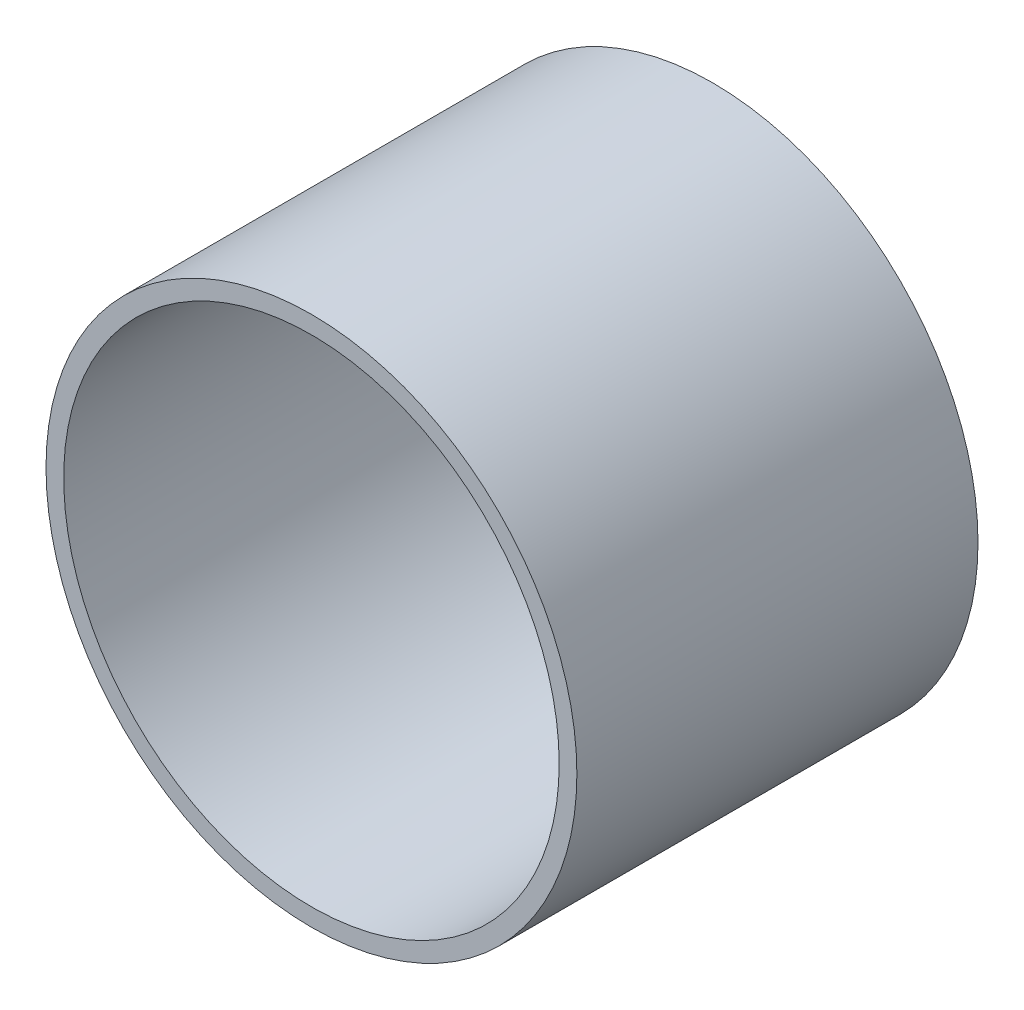
ISO-10303-21;
HEADER;
FILE_DESCRIPTION(('STEP AP214'),'2;1');
FILE_NAME('part.step','',(''),(''),'','','');
FILE_SCHEMA(('AUTOMOTIVE_DESIGN { 1 0 10303 214 1 1 1 1 }'));
ENDSEC;
DATA;
#1=APPLICATION_CONTEXT('core data for automotive mechanical design processes');
#2=APPLICATION_PROTOCOL_DEFINITION('international standard','automotive_design',2000,#1);
#3=PRODUCT_CONTEXT('',#1,'mechanical');
#4=PRODUCT('Part','Part','',(#3));
#5=PRODUCT_RELATED_PRODUCT_CATEGORY('part','',(#4));
#6=PRODUCT_DEFINITION_FORMATION('','',#4);
#7=PRODUCT_DEFINITION_CONTEXT('part definition',#1,'design');
#8=PRODUCT_DEFINITION('design','',#6,#7);
#9=PRODUCT_DEFINITION_SHAPE('','',#8);
#10=(LENGTH_UNIT() NAMED_UNIT(*) SI_UNIT(.MILLI.,.METRE.));
#11=(NAMED_UNIT(*) PLANE_ANGLE_UNIT() SI_UNIT($,.RADIAN.));
#12=(NAMED_UNIT(*) SI_UNIT($,.STERADIAN.) SOLID_ANGLE_UNIT());
#13=UNCERTAINTY_MEASURE_WITH_UNIT(LENGTH_MEASURE(1.E-05),#10,'distance_accuracy_value','');
#14=(GEOMETRIC_REPRESENTATION_CONTEXT(3) GLOBAL_UNCERTAINTY_ASSIGNED_CONTEXT((#13)) GLOBAL_UNIT_ASSIGNED_CONTEXT((#10,
#11,#12)) REPRESENTATION_CONTEXT('',''));
#15=CARTESIAN_POINT('',(0.,0.,0.));
#16=DIRECTION('',(0.,0.,1.));
#17=DIRECTION('',(1.,0.,0.));
#18=AXIS2_PLACEMENT_3D('',#15,#16,#17);
#19=CARTESIAN_POINT('',(0.,0.,-132.));
#20=DIRECTION('',(0.,0.,1.));
#21=DIRECTION('',(1.,0.,0.));
#22=AXIS2_PLACEMENT_3D('',#19,#20,#21);
#23=CYLINDRICAL_SURFACE('',#22,42.);
#24=CARTESIAN_POINT('',(0.,0.,-205.));
#25=DIRECTION('',(0.,0.,1.));
#26=DIRECTION('',(1.,0.,0.));
#27=AXIS2_PLACEMENT_3D('',#24,#25,#26);
#28=CIRCLE('',#27,42.);
#29=CARTESIAN_POINT('',(42.,0.,-205.));
#30=VERTEX_POINT('',#29);
#31=EDGE_CURVE('E10',#30,#30,#28,.T.);
#32=ORIENTED_EDGE('',*,*,#31,.F.);
#33=EDGE_LOOP('',(#32));
#34=FACE_BOUND('',#33,.T.);
#35=CARTESIAN_POINT('',(0.,0.,-137.));
#36=DIRECTION('',(0.,0.,1.));
#37=DIRECTION('',(1.,0.,0.));
#38=AXIS2_PLACEMENT_3D('',#35,#36,#37);
#39=CIRCLE('',#38,42.);
#40=CARTESIAN_POINT('',(42.,0.,-137.));
#41=VERTEX_POINT('',#40);
#42=EDGE_CURVE('E51',#41,#41,#39,.T.);
#43=ORIENTED_EDGE('',*,*,#42,.T.);
#44=EDGE_LOOP('',(#43));
#45=FACE_BOUND('',#44,.T.);
#46=ADVANCED_FACE('F37',(#34,#45),#23,.F.);
#47=CARTESIAN_POINT('',(0.,42.,-205.));
#48=DIRECTION('',(0.,0.,1.));
#49=DIRECTION('',(1.,0.,0.));
#50=AXIS2_PLACEMENT_3D('',#47,#48,#49);
#51=PLANE('',#50);
#52=CARTESIAN_POINT('',(0.,0.,-205.));
#53=DIRECTION('',(0.,0.,1.));
#54=DIRECTION('',(1.,0.,0.));
#55=AXIS2_PLACEMENT_3D('',#52,#53,#54);
#56=CIRCLE('',#55,45.);
#57=CARTESIAN_POINT('',(45.,0.,-205.));
#58=VERTEX_POINT('',#57);
#59=EDGE_CURVE('E43',#58,#58,#56,.T.);
#60=ORIENTED_EDGE('',*,*,#59,.F.);
#61=EDGE_LOOP('',(#60));
#62=FACE_BOUND('',#61,.T.);
#63=ORIENTED_EDGE('',*,*,#31,.T.);
#64=EDGE_LOOP('',(#63));
#65=FACE_BOUND('',#64,.T.);
#66=ADVANCED_FACE('F66',(#62,#65),#51,.F.);
#67=CARTESIAN_POINT('',(0.,0.,-132.));
#68=DIRECTION('',(0.,0.,1.));
#69=DIRECTION('',(1.,0.,0.));
#70=AXIS2_PLACEMENT_3D('',#67,#68,#69);
#71=CYLINDRICAL_SURFACE('',#70,45.);
#72=CARTESIAN_POINT('',(0.,0.,-137.));
#73=DIRECTION('',(0.,0.,1.));
#74=DIRECTION('',(1.,0.,0.));
#75=AXIS2_PLACEMENT_3D('',#72,#73,#74);
#76=CIRCLE('',#75,45.);
#77=CARTESIAN_POINT('',(45.,0.,-137.));
#78=VERTEX_POINT('',#77);
#79=EDGE_CURVE('E47',#78,#78,#76,.T.);
#80=ORIENTED_EDGE('',*,*,#79,.F.);
#81=EDGE_LOOP('',(#80));
#82=FACE_BOUND('',#81,.T.);
#83=ORIENTED_EDGE('',*,*,#59,.T.);
#84=EDGE_LOOP('',(#83));
#85=FACE_BOUND('',#84,.T.);
#86=ADVANCED_FACE('F61',(#82,#85),#71,.T.);
#87=CARTESIAN_POINT('',(0.,45.,-137.));
#88=DIRECTION('',(0.,0.,-1.));
#89=DIRECTION('',(-1.,0.,0.));
#90=AXIS2_PLACEMENT_3D('',#87,#88,#89);
#91=PLANE('',#90);
#92=ORIENTED_EDGE('',*,*,#42,.F.);
#93=EDGE_LOOP('',(#92));
#94=FACE_BOUND('',#93,.T.);
#95=ORIENTED_EDGE('',*,*,#79,.T.);
#96=EDGE_LOOP('',(#95));
#97=FACE_BOUND('',#96,.T.);
#98=ADVANCED_FACE('F58',(#94,#97),#91,.F.);
#99=CLOSED_SHELL('',(#46,#66,#86,#98));
#100=MANIFOLD_SOLID_BREP('B2',#99);
#101=ADVANCED_BREP_SHAPE_REPRESENTATION('',(#18,#100),#14);
#102=SHAPE_DEFINITION_REPRESENTATION(#9,#101);
ENDSEC;
END-ISO-10303-21;
